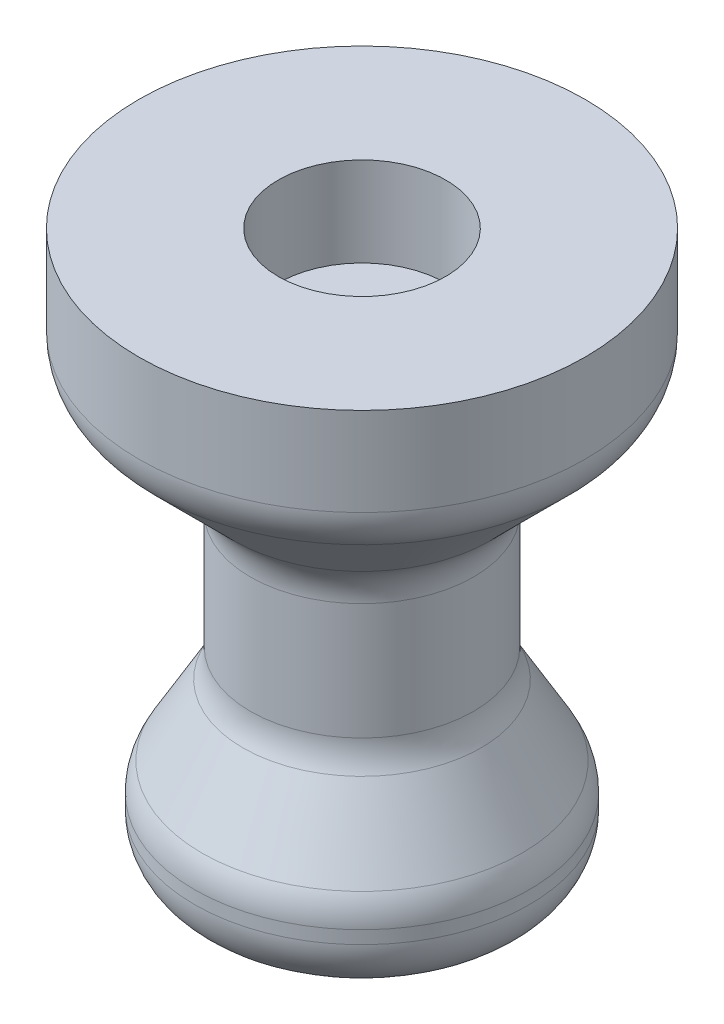
ISO-10303-21;
HEADER;
FILE_DESCRIPTION(('STEP AP214'),'2;1');
FILE_NAME('part.step','',(''),(''),'','','');
FILE_SCHEMA(('AUTOMOTIVE_DESIGN { 1 0 10303 214 1 1 1 1 }'));
ENDSEC;
DATA;
#1=APPLICATION_CONTEXT('core data for automotive mechanical design processes');
#2=APPLICATION_PROTOCOL_DEFINITION('international standard','automotive_design',2000,#1);
#3=PRODUCT_CONTEXT('',#1,'mechanical');
#4=PRODUCT('Part','Part','',(#3));
#5=PRODUCT_RELATED_PRODUCT_CATEGORY('part','',(#4));
#6=PRODUCT_DEFINITION_FORMATION('','',#4);
#7=PRODUCT_DEFINITION_CONTEXT('part definition',#1,'design');
#8=PRODUCT_DEFINITION('design','',#6,#7);
#9=PRODUCT_DEFINITION_SHAPE('','',#8);
#10=(LENGTH_UNIT() NAMED_UNIT(*) SI_UNIT(.MILLI.,.METRE.));
#11=(NAMED_UNIT(*) PLANE_ANGLE_UNIT() SI_UNIT($,.RADIAN.));
#12=(NAMED_UNIT(*) SI_UNIT($,.STERADIAN.) SOLID_ANGLE_UNIT());
#13=UNCERTAINTY_MEASURE_WITH_UNIT(LENGTH_MEASURE(1.E-05),#10,'distance_accuracy_value','');
#14=(GEOMETRIC_REPRESENTATION_CONTEXT(3) GLOBAL_UNCERTAINTY_ASSIGNED_CONTEXT((#13)) GLOBAL_UNIT_ASSIGNED_CONTEXT((#10,
#11,#12)) REPRESENTATION_CONTEXT('',''));
#15=CARTESIAN_POINT('',(0.,0.,0.));
#16=DIRECTION('',(0.,0.,1.));
#17=DIRECTION('',(1.,0.,0.));
#18=AXIS2_PLACEMENT_3D('',#15,#16,#17);
#19=CARTESIAN_POINT('',(0.,0.,0.));
#20=DIRECTION('',(0.,-1.,0.));
#21=DIRECTION('',(0.,0.,-1.));
#22=AXIS2_PLACEMENT_3D('',#19,#20,#21);
#23=PLANE('',#22);
#24=CARTESIAN_POINT('',(0.,0.,0.));
#25=DIRECTION('',(0.,1.,0.));
#26=DIRECTION('',(0.,0.,1.));
#27=AXIS2_PLACEMENT_3D('',#24,#25,#26);
#28=CIRCLE('',#27,3.);
#29=CARTESIAN_POINT('',(0.,0.,3.));
#30=VERTEX_POINT('',#29);
#31=EDGE_CURVE('E74',#30,#30,#28,.T.);
#32=ORIENTED_EDGE('',*,*,#31,.F.);
#33=EDGE_LOOP('',(#32));
#34=FACE_BOUND('',#33,.T.);
#35=CARTESIAN_POINT('',(0.,0.,0.));
#36=DIRECTION('',(0.,1.,0.));
#37=DIRECTION('',(0.,0.,1.));
#38=AXIS2_PLACEMENT_3D('',#35,#36,#37);
#39=CIRCLE('',#38,8.);
#40=CARTESIAN_POINT('',(0.,0.,8.));
#41=VERTEX_POINT('',#40);
#42=EDGE_CURVE('E70',#41,#41,#39,.T.);
#43=ORIENTED_EDGE('',*,*,#42,.T.);
#44=EDGE_LOOP('',(#43));
#45=FACE_BOUND('',#44,.T.);
#46=ADVANCED_FACE('F32',(#34,#45),#23,.F.);
#47=CARTESIAN_POINT('',(0.,48.5860082428088,0.));
#48=DIRECTION('',(0.,1.,0.));
#49=DIRECTION('',(0.,0.,1.));
#50=AXIS2_PLACEMENT_3D('',#47,#48,#49);
#51=CYLINDRICAL_SURFACE('',#50,8.);
#52=CARTESIAN_POINT('',(0.,-3.17157287525381,0.));
#53=DIRECTION('',(0.,-1.,0.));
#54=DIRECTION('',(0.,0.,-1.));
#55=AXIS2_PLACEMENT_3D('',#52,#53,#54);
#56=CIRCLE('',#55,8.);
#57=CARTESIAN_POINT('',(0.,-3.17157287525381,-8.));
#58=VERTEX_POINT('',#57);
#59=EDGE_CURVE('E67',#58,#58,#56,.F.);
#60=ORIENTED_EDGE('',*,*,#59,.T.);
#61=EDGE_LOOP('',(#60));
#62=FACE_BOUND('',#61,.T.);
#63=ORIENTED_EDGE('',*,*,#42,.F.);
#64=EDGE_LOOP('',(#63));
#65=FACE_BOUND('',#64,.T.);
#66=ADVANCED_FACE('F90',(#62,#65),#51,.T.);
#67=CARTESIAN_POINT('',(0.,-7.99999999999999,0.));
#68=DIRECTION('',(0.,1.,0.));
#69=DIRECTION('',(0.,0.,1.));
#70=AXIS2_PLACEMENT_3D('',#67,#68,#69);
#71=CONICAL_SURFACE('',#70,4.00000000000001,0.78539816339745);
#72=CARTESIAN_POINT('',(0.,-4.58578643762691,0.));
#73=DIRECTION('',(0.,-1.,0.));
#74=DIRECTION('',(0.,0.,-1.));
#75=AXIS2_PLACEMENT_3D('',#72,#73,#74);
#76=CIRCLE('',#75,7.4142135623731);
#77=CARTESIAN_POINT('',(0.,-4.58578643762691,-7.4142135623731));
#78=VERTEX_POINT('',#77);
#79=EDGE_CURVE('E61',#78,#78,#76,.T.);
#80=ORIENTED_EDGE('',*,*,#79,.T.);
#81=EDGE_LOOP('',(#80));
#82=FACE_BOUND('',#81,.T.);
#83=CARTESIAN_POINT('',(0.,-7.41421356237308,0.));
#84=DIRECTION('',(0.,1.,0.));
#85=DIRECTION('',(0.,0.,1.));
#86=AXIS2_PLACEMENT_3D('',#83,#84,#85);
#87=CIRCLE('',#86,4.58578643762691);
#88=CARTESIAN_POINT('',(0.,-7.41421356237308,4.58578643762691));
#89=VERTEX_POINT('',#88);
#90=EDGE_CURVE('E64',#89,#89,#87,.T.);
#91=ORIENTED_EDGE('',*,*,#90,.T.);
#92=EDGE_LOOP('',(#91));
#93=FACE_BOUND('',#92,.T.);
#94=ADVANCED_FACE('F95',(#82,#93),#71,.T.);
#95=CARTESIAN_POINT('',(0.,48.5860082428088,0.));
#96=DIRECTION('',(0.,1.,0.));
#97=DIRECTION('',(0.,0.,1.));
#98=AXIS2_PLACEMENT_3D('',#95,#96,#97);
#99=CYLINDRICAL_SURFACE('',#98,4.00000000000001);
#100=CARTESIAN_POINT('',(0.,-13.,0.));
#101=DIRECTION('',(0.,1.,0.));
#102=DIRECTION('',(0.,0.,1.));
#103=AXIS2_PLACEMENT_3D('',#100,#101,#102);
#104=CIRCLE('',#103,4.00000000000001);
#105=CARTESIAN_POINT('',(0.,-13.,4.00000000000001));
#106=VERTEX_POINT('',#105);
#107=EDGE_CURVE('E10',#106,#106,#104,.T.);
#108=ORIENTED_EDGE('',*,*,#107,.T.);
#109=EDGE_LOOP('',(#108));
#110=FACE_BOUND('',#109,.T.);
#111=CARTESIAN_POINT('',(0.,-8.82842712474618,0.));
#112=DIRECTION('',(0.,1.,0.));
#113=DIRECTION('',(0.,0.,1.));
#114=AXIS2_PLACEMENT_3D('',#111,#112,#113);
#115=CIRCLE('',#114,4.00000000000001);
#116=CARTESIAN_POINT('',(0.,-8.82842712474618,4.00000000000001));
#117=VERTEX_POINT('',#116);
#118=EDGE_CURVE('E39',#117,#117,#115,.F.);
#119=ORIENTED_EDGE('',*,*,#118,.T.);
#120=EDGE_LOOP('',(#119));
#121=FACE_BOUND('',#120,.T.);
#122=ADVANCED_FACE('F101',(#110,#121),#99,.T.);
#123=CARTESIAN_POINT('',(0.,-17.,0.));
#124=DIRECTION('',(0.,-1.,0.));
#125=DIRECTION('',(0.,0.,-1.));
#126=AXIS2_PLACEMENT_3D('',#123,#124,#125);
#127=CONICAL_SURFACE('',#126,6.00000000000001,0.523598775598301);
#128=CARTESIAN_POINT('',(0.,-16.5358983848622,0.));
#129=DIRECTION('',(0.,1.,0.));
#130=DIRECTION('',(0.,0.,1.));
#131=AXIS2_PLACEMENT_3D('',#128,#129,#130);
#132=CIRCLE('',#131,5.73205080756888);
#133=CARTESIAN_POINT('',(0.,-16.5358983848622,5.73205080756888));
#134=VERTEX_POINT('',#133);
#135=EDGE_CURVE('E43',#134,#134,#132,.T.);
#136=ORIENTED_EDGE('',*,*,#135,.T.);
#137=EDGE_LOOP('',(#136));
#138=FACE_BOUND('',#137,.T.);
#139=CARTESIAN_POINT('',(0.,-14.,0.));
#140=DIRECTION('',(0.,-1.,0.));
#141=DIRECTION('',(0.,0.,-1.));
#142=AXIS2_PLACEMENT_3D('',#139,#140,#141);
#143=CIRCLE('',#142,4.26794919243113);
#144=CARTESIAN_POINT('',(0.,-14.,-4.26794919243113));
#145=VERTEX_POINT('',#144);
#146=EDGE_CURVE('E47',#145,#145,#143,.T.);
#147=ORIENTED_EDGE('',*,*,#146,.T.);
#148=EDGE_LOOP('',(#147));
#149=FACE_BOUND('',#148,.T.);
#150=ADVANCED_FACE('F128',(#138,#149),#127,.T.);
#151=CARTESIAN_POINT('',(0.,48.5860082428088,0.));
#152=DIRECTION('',(0.,1.,0.));
#153=DIRECTION('',(0.,0.,1.));
#154=AXIS2_PLACEMENT_3D('',#151,#152,#153);
#155=CYLINDRICAL_SURFACE('',#154,6.00000000000001);
#156=CARTESIAN_POINT('',(0.,-18.,0.));
#157=DIRECTION('',(0.,1.,0.));
#158=DIRECTION('',(0.,0.,1.));
#159=AXIS2_PLACEMENT_3D('',#156,#157,#158);
#160=CIRCLE('',#159,6.00000000000001);
#161=CARTESIAN_POINT('',(0.,-18.,6.00000000000001));
#162=VERTEX_POINT('',#161);
#163=EDGE_CURVE('E55',#162,#162,#160,.T.);
#164=ORIENTED_EDGE('',*,*,#163,.T.);
#165=EDGE_LOOP('',(#164));
#166=FACE_BOUND('',#165,.T.);
#167=CARTESIAN_POINT('',(0.,-17.5358983848622,0.));
#168=DIRECTION('',(0.,-1.,0.));
#169=DIRECTION('',(0.,0.,-1.));
#170=AXIS2_PLACEMENT_3D('',#167,#168,#169);
#171=CIRCLE('',#170,6.00000000000001);
#172=CARTESIAN_POINT('',(0.,-17.5358983848622,-6.00000000000001));
#173=VERTEX_POINT('',#172);
#174=EDGE_CURVE('E58',#173,#173,#171,.T.);
#175=ORIENTED_EDGE('',*,*,#174,.T.);
#176=EDGE_LOOP('',(#175));
#177=FACE_BOUND('',#176,.T.);
#178=ADVANCED_FACE('F130',(#166,#177),#155,.T.);
#179=CARTESIAN_POINT('',(6.00000000000001,-20.,0.));
#180=DIRECTION('',(0.,1.,0.));
#181=DIRECTION('',(0.,0.,1.));
#182=AXIS2_PLACEMENT_3D('',#179,#180,#181);
#183=PLANE('',#182);
#184=CARTESIAN_POINT('',(0.,-20.,0.));
#185=DIRECTION('',(0.,1.,0.));
#186=DIRECTION('',(0.,0.,1.));
#187=AXIS2_PLACEMENT_3D('',#184,#185,#186);
#188=CIRCLE('',#187,4.00000000000001);
#189=CARTESIAN_POINT('',(0.,-20.,4.00000000000001));
#190=VERTEX_POINT('',#189);
#191=EDGE_CURVE('E52',#190,#190,#188,.F.);
#192=ORIENTED_EDGE('',*,*,#191,.T.);
#193=EDGE_LOOP('',(#192));
#194=FACE_BOUND('',#193,.T.);
#195=ADVANCED_FACE('F110',(#194),#183,.F.);
#196=CARTESIAN_POINT('',(0.,-3.17157287525381,0.));
#197=DIRECTION('',(0.,-1.,0.));
#198=DIRECTION('',(0.,0.,-1.));
#199=AXIS2_PLACEMENT_3D('',#196,#197,#198);
#200=TOROIDAL_SURFACE('',#199,6.,2.);
#201=ORIENTED_EDGE('',*,*,#79,.F.);
#202=EDGE_LOOP('',(#201));
#203=FACE_BOUND('',#202,.T.);
#204=ORIENTED_EDGE('',*,*,#59,.F.);
#205=EDGE_LOOP('',(#204));
#206=FACE_BOUND('',#205,.T.);
#207=ADVANCED_FACE('F106',(#203,#206),#200,.T.);
#208=CARTESIAN_POINT('',(0.,-18.,0.));
#209=DIRECTION('',(0.,1.,0.));
#210=DIRECTION('',(0.,0.,1.));
#211=AXIS2_PLACEMENT_3D('',#208,#209,#210);
#212=TOROIDAL_SURFACE('',#211,4.00000000000001,2.);
#213=ORIENTED_EDGE('',*,*,#191,.F.);
#214=EDGE_LOOP('',(#213));
#215=FACE_BOUND('',#214,.T.);
#216=ORIENTED_EDGE('',*,*,#163,.F.);
#217=EDGE_LOOP('',(#216));
#218=FACE_BOUND('',#217,.T.);
#219=ADVANCED_FACE('F109',(#215,#218),#212,.T.);
#220=CARTESIAN_POINT('',(0.,-17.5358983848622,0.));
#221=DIRECTION('',(0.,-1.,0.));
#222=DIRECTION('',(0.,0.,-1.));
#223=AXIS2_PLACEMENT_3D('',#220,#221,#222);
#224=TOROIDAL_SURFACE('',#223,4.00000000000001,2.);
#225=ORIENTED_EDGE('',*,*,#174,.F.);
#226=EDGE_LOOP('',(#225));
#227=FACE_BOUND('',#226,.T.);
#228=ORIENTED_EDGE('',*,*,#135,.F.);
#229=EDGE_LOOP('',(#228));
#230=FACE_BOUND('',#229,.T.);
#231=ADVANCED_FACE('F114',(#227,#230),#224,.T.);
#232=CARTESIAN_POINT('',(0.,-13.,0.));
#233=DIRECTION('',(0.,1.,0.));
#234=DIRECTION('',(0.,0.,1.));
#235=AXIS2_PLACEMENT_3D('',#232,#233,#234);
#236=TOROIDAL_SURFACE('',#235,6.00000000000001,2.);
#237=ORIENTED_EDGE('',*,*,#146,.F.);
#238=EDGE_LOOP('',(#237));
#239=FACE_BOUND('',#238,.T.);
#240=ORIENTED_EDGE('',*,*,#107,.F.);
#241=EDGE_LOOP('',(#240));
#242=FACE_BOUND('',#241,.T.);
#243=ADVANCED_FACE('F117',(#239,#242),#236,.F.);
#244=CARTESIAN_POINT('',(0.,-8.82842712474618,0.));
#245=DIRECTION('',(0.,1.,0.));
#246=DIRECTION('',(0.,0.,1.));
#247=AXIS2_PLACEMENT_3D('',#244,#245,#246);
#248=TOROIDAL_SURFACE('',#247,6.00000000000001,2.);
#249=ORIENTED_EDGE('',*,*,#118,.F.);
#250=EDGE_LOOP('',(#249));
#251=FACE_BOUND('',#250,.T.);
#252=ORIENTED_EDGE('',*,*,#90,.F.);
#253=EDGE_LOOP('',(#252));
#254=FACE_BOUND('',#253,.T.);
#255=ADVANCED_FACE('F34',(#251,#254),#248,.F.);
#256=CARTESIAN_POINT('',(0.,-3.2,0.));
#257=DIRECTION('',(0.,1.,0.));
#258=DIRECTION('',(0.,0.,1.));
#259=AXIS2_PLACEMENT_3D('',#256,#257,#258);
#260=CYLINDRICAL_SURFACE('',#259,3.);
#261=CARTESIAN_POINT('',(0.,-3.2,0.));
#262=DIRECTION('',(0.,1.,0.));
#263=DIRECTION('',(0.,0.,1.));
#264=AXIS2_PLACEMENT_3D('',#261,#262,#263);
#265=CIRCLE('',#264,3.);
#266=CARTESIAN_POINT('',(0.,-3.2,3.));
#267=VERTEX_POINT('',#266);
#268=EDGE_CURVE('E73',#267,#267,#265,.T.);
#269=ORIENTED_EDGE('',*,*,#268,.F.);
#270=EDGE_LOOP('',(#269));
#271=FACE_BOUND('',#270,.T.);
#272=ORIENTED_EDGE('',*,*,#31,.T.);
#273=EDGE_LOOP('',(#272));
#274=FACE_BOUND('',#273,.T.);
#275=ADVANCED_FACE('F82',(#271,#274),#260,.F.);
#276=CARTESIAN_POINT('',(0.,-3.2,0.));
#277=DIRECTION('',(0.,1.,0.));
#278=DIRECTION('',(0.,0.,1.));
#279=AXIS2_PLACEMENT_3D('',#276,#277,#278);
#280=PLANE('',#279);
#281=ORIENTED_EDGE('',*,*,#268,.T.);
#282=EDGE_LOOP('',(#281));
#283=FACE_BOUND('',#282,.T.);
#284=ADVANCED_FACE('F80',(#283),#280,.T.);
#285=CLOSED_SHELL('',(#46,#66,#94,#122,#150,#178,#195,#207,#219,#231,#243,#255,#275,#284));
#286=MANIFOLD_SOLID_BREP('B2',#285);
#287=ADVANCED_BREP_SHAPE_REPRESENTATION('',(#18,#286),#14);
#288=SHAPE_DEFINITION_REPRESENTATION(#9,#287);
ENDSEC;
END-ISO-10303-21;
